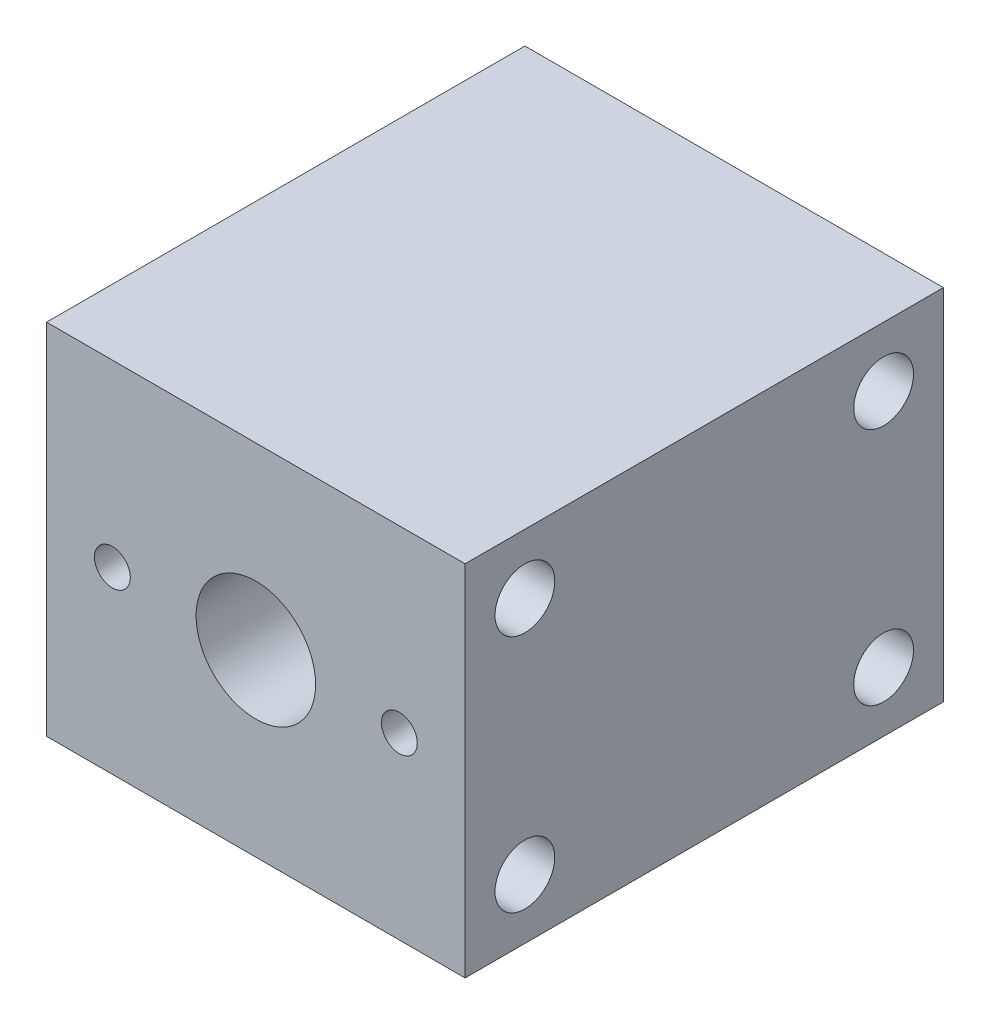
ISO-10303-21;
HEADER;
FILE_DESCRIPTION(('STEP AP214'),'2;1');
FILE_NAME('part.step','',(''),(''),'','','');
FILE_SCHEMA(('AUTOMOTIVE_DESIGN { 1 0 10303 214 1 1 1 1 }'));
ENDSEC;
DATA;
#1=APPLICATION_CONTEXT('core data for automotive mechanical design processes');
#2=APPLICATION_PROTOCOL_DEFINITION('international standard','automotive_design',2000,#1);
#3=PRODUCT_CONTEXT('',#1,'mechanical');
#4=PRODUCT('Part','Part','',(#3));
#5=PRODUCT_RELATED_PRODUCT_CATEGORY('part','',(#4));
#6=PRODUCT_DEFINITION_FORMATION('','',#4);
#7=PRODUCT_DEFINITION_CONTEXT('part definition',#1,'design');
#8=PRODUCT_DEFINITION('design','',#6,#7);
#9=PRODUCT_DEFINITION_SHAPE('','',#8);
#10=(LENGTH_UNIT() NAMED_UNIT(*) SI_UNIT(.MILLI.,.METRE.));
#11=(NAMED_UNIT(*) PLANE_ANGLE_UNIT() SI_UNIT($,.RADIAN.));
#12=(NAMED_UNIT(*) SI_UNIT($,.STERADIAN.) SOLID_ANGLE_UNIT());
#13=UNCERTAINTY_MEASURE_WITH_UNIT(LENGTH_MEASURE(1.E-05),#10,'distance_accuracy_value','');
#14=(GEOMETRIC_REPRESENTATION_CONTEXT(3) GLOBAL_UNCERTAINTY_ASSIGNED_CONTEXT((#13)) GLOBAL_UNIT_ASSIGNED_CONTEXT((#10,
#11,#12)) REPRESENTATION_CONTEXT('',''));
#15=CARTESIAN_POINT('',(0.,0.,0.));
#16=DIRECTION('',(0.,0.,1.));
#17=DIRECTION('',(1.,0.,0.));
#18=AXIS2_PLACEMENT_3D('',#15,#16,#17);
#19=CARTESIAN_POINT('',(0.,0.,20.));
#20=DIRECTION('',(0.,0.,-1.));
#21=DIRECTION('',(-1.,0.,0.));
#22=AXIS2_PLACEMENT_3D('',#19,#20,#21);
#23=PLANE('',#22);
#24=CARTESIAN_POINT('',(-12.,0.,20.));
#25=DIRECTION('',(0.,0.,1.));
#26=DIRECTION('',(1.,0.,0.));
#27=AXIS2_PLACEMENT_3D('',#24,#25,#26);
#28=CIRCLE('',#27,1.5);
#29=CARTESIAN_POINT('',(-10.5,0.,20.));
#30=VERTEX_POINT('',#29);
#31=EDGE_CURVE('E147',#30,#30,#28,.T.);
#32=ORIENTED_EDGE('',*,*,#31,.F.);
#33=EDGE_LOOP('',(#32));
#34=FACE_BOUND('',#33,.T.);
#35=CARTESIAN_POINT('',(12.,0.,20.));
#36=DIRECTION('',(0.,0.,1.));
#37=DIRECTION('',(1.,0.,0.));
#38=AXIS2_PLACEMENT_3D('',#35,#36,#37);
#39=CIRCLE('',#38,1.5);
#40=CARTESIAN_POINT('',(13.5,0.,20.));
#41=VERTEX_POINT('',#40);
#42=EDGE_CURVE('E141',#41,#41,#39,.T.);
#43=ORIENTED_EDGE('',*,*,#42,.F.);
#44=EDGE_LOOP('',(#43));
#45=FACE_BOUND('',#44,.T.);
#46=DIRECTION('',(0.,1.,0.));
#47=VECTOR('',#46,1.);
#48=CARTESIAN_POINT('',(17.5,-15.,20.));
#49=LINE('',#48,#47);
#50=CARTESIAN_POINT('',(17.5,-15.,20.));
#51=VERTEX_POINT('',#50);
#52=CARTESIAN_POINT('',(17.5,15.,20.));
#53=VERTEX_POINT('',#52);
#54=EDGE_CURVE('E84',#51,#53,#49,.T.);
#55=ORIENTED_EDGE('',*,*,#54,.T.);
#56=DIRECTION('',(-1.,0.,0.));
#57=VECTOR('',#56,1.);
#58=CARTESIAN_POINT('',(-17.5,15.,20.));
#59=LINE('',#58,#57);
#60=CARTESIAN_POINT('',(-17.5,15.,20.));
#61=VERTEX_POINT('',#60);
#62=EDGE_CURVE('E79',#53,#61,#59,.T.);
#63=ORIENTED_EDGE('',*,*,#62,.T.);
#64=DIRECTION('',(0.,-1.,0.));
#65=VECTOR('',#64,1.);
#66=CARTESIAN_POINT('',(-17.5,-15.,20.));
#67=LINE('',#66,#65);
#68=CARTESIAN_POINT('',(-17.5,-15.,20.));
#69=VERTEX_POINT('',#68);
#70=EDGE_CURVE('E82',#61,#69,#67,.T.);
#71=ORIENTED_EDGE('',*,*,#70,.T.);
#72=DIRECTION('',(1.,0.,0.));
#73=VECTOR('',#72,1.);
#74=CARTESIAN_POINT('',(-17.5,-15.,20.));
#75=LINE('',#74,#73);
#76=EDGE_CURVE('E49',#69,#51,#75,.T.);
#77=ORIENTED_EDGE('',*,*,#76,.T.);
#78=EDGE_LOOP('',(#55,#63,#71,#77));
#79=FACE_BOUND('',#78,.T.);
#80=CARTESIAN_POINT('',(0.,0.,20.));
#81=DIRECTION('',(0.,0.,1.));
#82=DIRECTION('',(1.,0.,0.));
#83=AXIS2_PLACEMENT_3D('',#80,#81,#82);
#84=CIRCLE('',#83,5.);
#85=CARTESIAN_POINT('',(5.,0.,20.));
#86=VERTEX_POINT('',#85);
#87=EDGE_CURVE('E99',#86,#86,#84,.T.);
#88=ORIENTED_EDGE('',*,*,#87,.F.);
#89=EDGE_LOOP('',(#88));
#90=FACE_BOUND('',#89,.T.);
#91=ADVANCED_FACE('F32',(#34,#45,#79,#90),#23,.F.);
#92=CARTESIAN_POINT('',(0.,0.,-20.));
#93=DIRECTION('',(0.,0.,-1.));
#94=DIRECTION('',(-1.,0.,0.));
#95=AXIS2_PLACEMENT_3D('',#92,#93,#94);
#96=PLANE('',#95);
#97=CARTESIAN_POINT('',(-12.,0.,-20.));
#98=DIRECTION('',(0.,0.,1.));
#99=DIRECTION('',(1.,0.,0.));
#100=AXIS2_PLACEMENT_3D('',#97,#98,#99);
#101=CIRCLE('',#100,1.5);
#102=CARTESIAN_POINT('',(-10.5,0.,-20.));
#103=VERTEX_POINT('',#102);
#104=EDGE_CURVE('E144',#103,#103,#101,.T.);
#105=ORIENTED_EDGE('',*,*,#104,.T.);
#106=EDGE_LOOP('',(#105));
#107=FACE_BOUND('',#106,.T.);
#108=CARTESIAN_POINT('',(12.,0.,-20.));
#109=DIRECTION('',(0.,0.,1.));
#110=DIRECTION('',(1.,0.,0.));
#111=AXIS2_PLACEMENT_3D('',#108,#109,#110);
#112=CIRCLE('',#111,1.5);
#113=CARTESIAN_POINT('',(13.5,0.,-20.));
#114=VERTEX_POINT('',#113);
#115=EDGE_CURVE('E138',#114,#114,#112,.T.);
#116=ORIENTED_EDGE('',*,*,#115,.T.);
#117=EDGE_LOOP('',(#116));
#118=FACE_BOUND('',#117,.T.);
#119=DIRECTION('',(0.,1.,0.));
#120=VECTOR('',#119,1.);
#121=CARTESIAN_POINT('',(17.5,-15.,-20.));
#122=LINE('',#121,#120);
#123=CARTESIAN_POINT('',(17.5,-15.,-20.));
#124=VERTEX_POINT('',#123);
#125=CARTESIAN_POINT('',(17.5,15.,-20.));
#126=VERTEX_POINT('',#125);
#127=EDGE_CURVE('E96',#124,#126,#122,.T.);
#128=ORIENTED_EDGE('',*,*,#127,.F.);
#129=DIRECTION('',(1.,0.,0.));
#130=VECTOR('',#129,1.);
#131=CARTESIAN_POINT('',(-17.5,-15.,-20.));
#132=LINE('',#131,#130);
#133=CARTESIAN_POINT('',(-17.5,-15.,-20.));
#134=VERTEX_POINT('',#133);
#135=EDGE_CURVE('E72',#134,#124,#132,.T.);
#136=ORIENTED_EDGE('',*,*,#135,.F.);
#137=DIRECTION('',(0.,-1.,0.));
#138=VECTOR('',#137,1.);
#139=CARTESIAN_POINT('',(-17.5,-15.,-20.));
#140=LINE('',#139,#138);
#141=CARTESIAN_POINT('',(-17.5,15.,-20.));
#142=VERTEX_POINT('',#141);
#143=EDGE_CURVE('E66',#142,#134,#140,.T.);
#144=ORIENTED_EDGE('',*,*,#143,.F.);
#145=DIRECTION('',(-1.,0.,0.));
#146=VECTOR('',#145,1.);
#147=CARTESIAN_POINT('',(-17.5,15.,-20.));
#148=LINE('',#147,#146);
#149=EDGE_CURVE('E88',#126,#142,#148,.T.);
#150=ORIENTED_EDGE('',*,*,#149,.F.);
#151=EDGE_LOOP('',(#128,#136,#144,#150));
#152=FACE_BOUND('',#151,.T.);
#153=CARTESIAN_POINT('',(0.,0.,-20.));
#154=DIRECTION('',(0.,0.,1.));
#155=DIRECTION('',(1.,0.,0.));
#156=AXIS2_PLACEMENT_3D('',#153,#154,#155);
#157=CIRCLE('',#156,5.);
#158=CARTESIAN_POINT('',(5.,0.,-20.));
#159=VERTEX_POINT('',#158);
#160=EDGE_CURVE('E111',#159,#159,#157,.T.);
#161=ORIENTED_EDGE('',*,*,#160,.T.);
#162=EDGE_LOOP('',(#161));
#163=FACE_BOUND('',#162,.T.);
#164=ADVANCED_FACE('F107',(#107,#118,#152,#163),#96,.T.);
#165=CARTESIAN_POINT('',(17.5,-15.,20.));
#166=DIRECTION('',(-1.,0.,0.));
#167=DIRECTION('',(0.,0.,1.));
#168=AXIS2_PLACEMENT_3D('',#165,#166,#167);
#169=PLANE('',#168);
#170=CARTESIAN_POINT('',(17.5,-10.,15.));
#171=DIRECTION('',(1.,0.,0.));
#172=DIRECTION('',(0.,0.,1.));
#173=AXIS2_PLACEMENT_3D('',#170,#171,#172);
#174=CIRCLE('',#173,2.5);
#175=CARTESIAN_POINT('',(17.5,-10.,17.5));
#176=VERTEX_POINT('',#175);
#177=EDGE_CURVE('E135',#176,#176,#174,.T.);
#178=ORIENTED_EDGE('',*,*,#177,.F.);
#179=EDGE_LOOP('',(#178));
#180=FACE_BOUND('',#179,.T.);
#181=CARTESIAN_POINT('',(17.5,-10.,-15.));
#182=DIRECTION('',(1.,0.,0.));
#183=DIRECTION('',(0.,0.,1.));
#184=AXIS2_PLACEMENT_3D('',#181,#182,#183);
#185=CIRCLE('',#184,2.5);
#186=CARTESIAN_POINT('',(17.5,-10.,-12.5));
#187=VERTEX_POINT('',#186);
#188=EDGE_CURVE('E129',#187,#187,#185,.T.);
#189=ORIENTED_EDGE('',*,*,#188,.F.);
#190=EDGE_LOOP('',(#189));
#191=FACE_BOUND('',#190,.T.);
#192=CARTESIAN_POINT('',(17.5,10.,-15.));
#193=DIRECTION('',(1.,0.,0.));
#194=DIRECTION('',(0.,0.,-1.));
#195=AXIS2_PLACEMENT_3D('',#192,#193,#194);
#196=CIRCLE('',#195,2.5);
#197=CARTESIAN_POINT('',(17.5,10.,-17.5));
#198=VERTEX_POINT('',#197);
#199=EDGE_CURVE('E123',#198,#198,#196,.T.);
#200=ORIENTED_EDGE('',*,*,#199,.F.);
#201=EDGE_LOOP('',(#200));
#202=FACE_BOUND('',#201,.T.);
#203=CARTESIAN_POINT('',(17.5,10.,15.));
#204=DIRECTION('',(1.,0.,0.));
#205=DIRECTION('',(0.,0.,-1.));
#206=AXIS2_PLACEMENT_3D('',#203,#204,#205);
#207=CIRCLE('',#206,2.5);
#208=CARTESIAN_POINT('',(17.5,10.,12.5));
#209=VERTEX_POINT('',#208);
#210=EDGE_CURVE('E117',#209,#209,#207,.T.);
#211=ORIENTED_EDGE('',*,*,#210,.F.);
#212=EDGE_LOOP('',(#211));
#213=FACE_BOUND('',#212,.T.);
#214=ORIENTED_EDGE('',*,*,#127,.T.);
#215=DIRECTION('',(0.,0.,-1.));
#216=VECTOR('',#215,1.);
#217=CARTESIAN_POINT('',(17.5,15.,20.));
#218=LINE('',#217,#216);
#219=EDGE_CURVE('E11',#53,#126,#218,.T.);
#220=ORIENTED_EDGE('',*,*,#219,.F.);
#221=ORIENTED_EDGE('',*,*,#54,.F.);
#222=DIRECTION('',(0.,0.,-1.));
#223=VECTOR('',#222,1.);
#224=CARTESIAN_POINT('',(17.5,-15.,20.));
#225=LINE('',#224,#223);
#226=EDGE_CURVE('E92',#51,#124,#225,.T.);
#227=ORIENTED_EDGE('',*,*,#226,.T.);
#228=EDGE_LOOP('',(#214,#220,#221,#227));
#229=FACE_BOUND('',#228,.T.);
#230=ADVANCED_FACE('F34',(#180,#191,#202,#213,#229),#169,.F.);
#231=CARTESIAN_POINT('',(-17.5,15.,20.));
#232=DIRECTION('',(0.,-1.,0.));
#233=DIRECTION('',(0.,0.,-1.));
#234=AXIS2_PLACEMENT_3D('',#231,#232,#233);
#235=PLANE('',#234);
#236=ORIENTED_EDGE('',*,*,#149,.T.);
#237=DIRECTION('',(0.,0.,-1.));
#238=VECTOR('',#237,1.);
#239=CARTESIAN_POINT('',(-17.5,15.,20.));
#240=LINE('',#239,#238);
#241=EDGE_CURVE('E41',#61,#142,#240,.T.);
#242=ORIENTED_EDGE('',*,*,#241,.F.);
#243=ORIENTED_EDGE('',*,*,#62,.F.);
#244=ORIENTED_EDGE('',*,*,#219,.T.);
#245=EDGE_LOOP('',(#236,#242,#243,#244));
#246=FACE_BOUND('',#245,.T.);
#247=ADVANCED_FACE('F87',(#246),#235,.F.);
#248=CARTESIAN_POINT('',(-17.5,-15.,20.));
#249=DIRECTION('',(1.,0.,0.));
#250=DIRECTION('',(0.,0.,-1.));
#251=AXIS2_PLACEMENT_3D('',#248,#249,#250);
#252=PLANE('',#251);
#253=CARTESIAN_POINT('',(-17.5,-10.,15.));
#254=DIRECTION('',(1.,0.,0.));
#255=DIRECTION('',(0.,0.,1.));
#256=AXIS2_PLACEMENT_3D('',#253,#254,#255);
#257=CIRCLE('',#256,2.5);
#258=CARTESIAN_POINT('',(-17.5,-10.,17.5));
#259=VERTEX_POINT('',#258);
#260=EDGE_CURVE('E132',#259,#259,#257,.T.);
#261=ORIENTED_EDGE('',*,*,#260,.T.);
#262=EDGE_LOOP('',(#261));
#263=FACE_BOUND('',#262,.T.);
#264=CARTESIAN_POINT('',(-17.5,-10.,-15.));
#265=DIRECTION('',(1.,0.,0.));
#266=DIRECTION('',(0.,0.,1.));
#267=AXIS2_PLACEMENT_3D('',#264,#265,#266);
#268=CIRCLE('',#267,2.5);
#269=CARTESIAN_POINT('',(-17.5,-10.,-12.5));
#270=VERTEX_POINT('',#269);
#271=EDGE_CURVE('E126',#270,#270,#268,.T.);
#272=ORIENTED_EDGE('',*,*,#271,.T.);
#273=EDGE_LOOP('',(#272));
#274=FACE_BOUND('',#273,.T.);
#275=CARTESIAN_POINT('',(-17.5,10.,-15.));
#276=DIRECTION('',(1.,0.,0.));
#277=DIRECTION('',(0.,0.,-1.));
#278=AXIS2_PLACEMENT_3D('',#275,#276,#277);
#279=CIRCLE('',#278,2.5);
#280=CARTESIAN_POINT('',(-17.5,10.,-17.5));
#281=VERTEX_POINT('',#280);
#282=EDGE_CURVE('E120',#281,#281,#279,.T.);
#283=ORIENTED_EDGE('',*,*,#282,.T.);
#284=EDGE_LOOP('',(#283));
#285=FACE_BOUND('',#284,.T.);
#286=CARTESIAN_POINT('',(-17.5,10.,15.));
#287=DIRECTION('',(1.,0.,0.));
#288=DIRECTION('',(0.,0.,-1.));
#289=AXIS2_PLACEMENT_3D('',#286,#287,#288);
#290=CIRCLE('',#289,2.5);
#291=CARTESIAN_POINT('',(-17.5,10.,12.5));
#292=VERTEX_POINT('',#291);
#293=EDGE_CURVE('E114',#292,#292,#290,.T.);
#294=ORIENTED_EDGE('',*,*,#293,.T.);
#295=EDGE_LOOP('',(#294));
#296=FACE_BOUND('',#295,.T.);
#297=ORIENTED_EDGE('',*,*,#143,.T.);
#298=DIRECTION('',(0.,0.,-1.));
#299=VECTOR('',#298,1.);
#300=CARTESIAN_POINT('',(-17.5,-15.,20.));
#301=LINE('',#300,#299);
#302=EDGE_CURVE('E89',#69,#134,#301,.T.);
#303=ORIENTED_EDGE('',*,*,#302,.F.);
#304=ORIENTED_EDGE('',*,*,#70,.F.);
#305=ORIENTED_EDGE('',*,*,#241,.T.);
#306=EDGE_LOOP('',(#297,#303,#304,#305));
#307=FACE_BOUND('',#306,.T.);
#308=ADVANCED_FACE('F90',(#263,#274,#285,#296,#307),#252,.F.);
#309=CARTESIAN_POINT('',(-17.5,-15.,20.));
#310=DIRECTION('',(0.,1.,0.));
#311=DIRECTION('',(0.,0.,1.));
#312=AXIS2_PLACEMENT_3D('',#309,#310,#311);
#313=PLANE('',#312);
#314=ORIENTED_EDGE('',*,*,#135,.T.);
#315=ORIENTED_EDGE('',*,*,#226,.F.);
#316=ORIENTED_EDGE('',*,*,#76,.F.);
#317=ORIENTED_EDGE('',*,*,#302,.T.);
#318=EDGE_LOOP('',(#314,#315,#316,#317));
#319=FACE_BOUND('',#318,.T.);
#320=ADVANCED_FACE('F104',(#319),#313,.F.);
#321=CARTESIAN_POINT('',(0.,0.,20.));
#322=DIRECTION('',(0.,0.,-1.));
#323=DIRECTION('',(-1.,0.,0.));
#324=AXIS2_PLACEMENT_3D('',#321,#322,#323);
#325=CYLINDRICAL_SURFACE('',#324,5.);
#326=ORIENTED_EDGE('',*,*,#87,.T.);
#327=EDGE_LOOP('',(#326));
#328=FACE_BOUND('',#327,.T.);
#329=ORIENTED_EDGE('',*,*,#160,.F.);
#330=EDGE_LOOP('',(#329));
#331=FACE_BOUND('',#330,.T.);
#332=ADVANCED_FACE('F189',(#328,#331),#325,.F.);
#333=CARTESIAN_POINT('',(-17.5,10.,15.));
#334=DIRECTION('',(1.,0.,0.));
#335=DIRECTION('',(0.,0.,-1.));
#336=AXIS2_PLACEMENT_3D('',#333,#334,#335);
#337=CYLINDRICAL_SURFACE('',#336,2.5);
#338=ORIENTED_EDGE('',*,*,#293,.F.);
#339=EDGE_LOOP('',(#338));
#340=FACE_BOUND('',#339,.T.);
#341=ORIENTED_EDGE('',*,*,#210,.T.);
#342=EDGE_LOOP('',(#341));
#343=FACE_BOUND('',#342,.T.);
#344=ADVANCED_FACE('F185',(#340,#343),#337,.F.);
#345=CARTESIAN_POINT('',(-17.5,10.,-15.));
#346=DIRECTION('',(1.,0.,0.));
#347=DIRECTION('',(0.,0.,-1.));
#348=AXIS2_PLACEMENT_3D('',#345,#346,#347);
#349=CYLINDRICAL_SURFACE('',#348,2.5);
#350=ORIENTED_EDGE('',*,*,#282,.F.);
#351=EDGE_LOOP('',(#350));
#352=FACE_BOUND('',#351,.T.);
#353=ORIENTED_EDGE('',*,*,#199,.T.);
#354=EDGE_LOOP('',(#353));
#355=FACE_BOUND('',#354,.T.);
#356=ADVANCED_FACE('F181',(#352,#355),#349,.F.);
#357=CARTESIAN_POINT('',(-17.5,-10.,-15.));
#358=DIRECTION('',(1.,0.,0.));
#359=DIRECTION('',(0.,0.,-1.));
#360=AXIS2_PLACEMENT_3D('',#357,#358,#359);
#361=CYLINDRICAL_SURFACE('',#360,2.5);
#362=ORIENTED_EDGE('',*,*,#271,.F.);
#363=EDGE_LOOP('',(#362));
#364=FACE_BOUND('',#363,.T.);
#365=ORIENTED_EDGE('',*,*,#188,.T.);
#366=EDGE_LOOP('',(#365));
#367=FACE_BOUND('',#366,.T.);
#368=ADVANCED_FACE('F174',(#364,#367),#361,.F.);
#369=CARTESIAN_POINT('',(-17.5,-10.,15.));
#370=DIRECTION('',(1.,0.,0.));
#371=DIRECTION('',(0.,0.,-1.));
#372=AXIS2_PLACEMENT_3D('',#369,#370,#371);
#373=CYLINDRICAL_SURFACE('',#372,2.5);
#374=ORIENTED_EDGE('',*,*,#260,.F.);
#375=EDGE_LOOP('',(#374));
#376=FACE_BOUND('',#375,.T.);
#377=ORIENTED_EDGE('',*,*,#177,.T.);
#378=EDGE_LOOP('',(#377));
#379=FACE_BOUND('',#378,.T.);
#380=ADVANCED_FACE('F168',(#376,#379),#373,.F.);
#381=CARTESIAN_POINT('',(12.,0.,-20.));
#382=DIRECTION('',(0.,0.,1.));
#383=DIRECTION('',(1.,0.,0.));
#384=AXIS2_PLACEMENT_3D('',#381,#382,#383);
#385=CYLINDRICAL_SURFACE('',#384,1.5);
#386=ORIENTED_EDGE('',*,*,#115,.F.);
#387=EDGE_LOOP('',(#386));
#388=FACE_BOUND('',#387,.T.);
#389=ORIENTED_EDGE('',*,*,#42,.T.);
#390=EDGE_LOOP('',(#389));
#391=FACE_BOUND('',#390,.T.);
#392=ADVANCED_FACE('F158',(#388,#391),#385,.F.);
#393=CARTESIAN_POINT('',(-12.,0.,-20.));
#394=DIRECTION('',(0.,0.,1.));
#395=DIRECTION('',(1.,0.,0.));
#396=AXIS2_PLACEMENT_3D('',#393,#394,#395);
#397=CYLINDRICAL_SURFACE('',#396,1.5);
#398=ORIENTED_EDGE('',*,*,#104,.F.);
#399=EDGE_LOOP('',(#398));
#400=FACE_BOUND('',#399,.T.);
#401=ORIENTED_EDGE('',*,*,#31,.T.);
#402=EDGE_LOOP('',(#401));
#403=FACE_BOUND('',#402,.T.);
#404=ADVANCED_FACE('F155',(#400,#403),#397,.F.);
#405=CLOSED_SHELL('',(#91,#164,#230,#247,#308,#320,#332,#344,#356,#368,#380,#392,#404));
#406=MANIFOLD_SOLID_BREP('B2',#405);
#407=ADVANCED_BREP_SHAPE_REPRESENTATION('',(#18,#406),#14);
#408=SHAPE_DEFINITION_REPRESENTATION(#9,#407);
ENDSEC;
END-ISO-10303-21;
